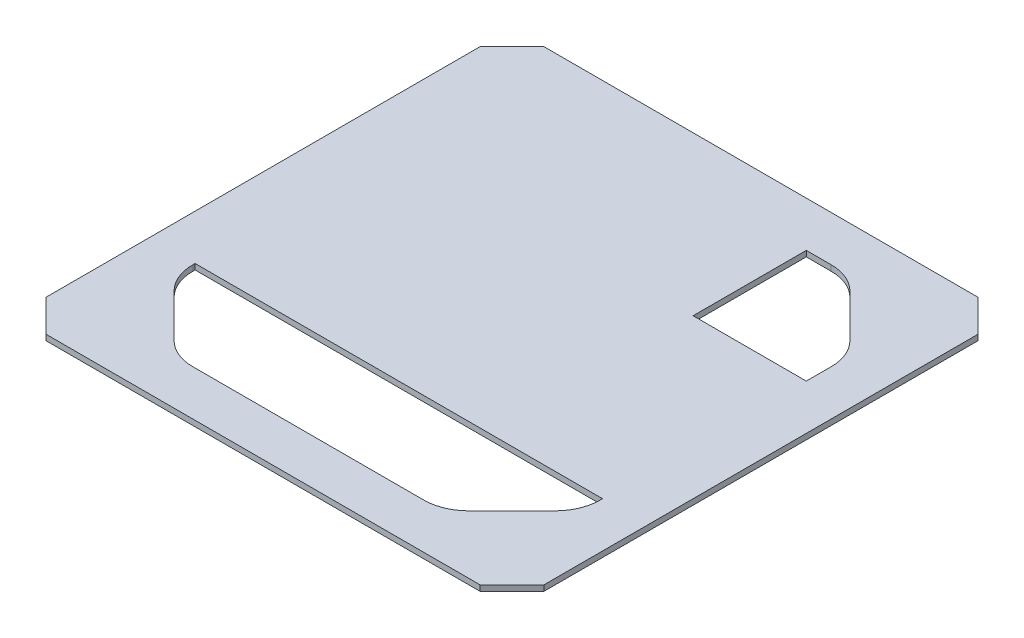
ISO-10303-21;
HEADER;
FILE_DESCRIPTION(('STEP AP214'),'2;1');
FILE_NAME('part.step','',(''),(''),'','','');
FILE_SCHEMA(('AUTOMOTIVE_DESIGN { 1 0 10303 214 1 1 1 1 }'));
ENDSEC;
DATA;
#1=APPLICATION_CONTEXT('core data for automotive mechanical design processes');
#2=APPLICATION_PROTOCOL_DEFINITION('international standard','automotive_design',2000,#1);
#3=PRODUCT_CONTEXT('',#1,'mechanical');
#4=PRODUCT('Part','Part','',(#3));
#5=PRODUCT_RELATED_PRODUCT_CATEGORY('part','',(#4));
#6=PRODUCT_DEFINITION_FORMATION('','',#4);
#7=PRODUCT_DEFINITION_CONTEXT('part definition',#1,'design');
#8=PRODUCT_DEFINITION('design','',#6,#7);
#9=PRODUCT_DEFINITION_SHAPE('','',#8);
#10=(LENGTH_UNIT() NAMED_UNIT(*) SI_UNIT(.MILLI.,.METRE.));
#11=(NAMED_UNIT(*) PLANE_ANGLE_UNIT() SI_UNIT($,.RADIAN.));
#12=(NAMED_UNIT(*) SI_UNIT($,.STERADIAN.) SOLID_ANGLE_UNIT());
#13=UNCERTAINTY_MEASURE_WITH_UNIT(LENGTH_MEASURE(1.E-05),#10,'distance_accuracy_value','');
#14=(GEOMETRIC_REPRESENTATION_CONTEXT(3) GLOBAL_UNCERTAINTY_ASSIGNED_CONTEXT((#13)) GLOBAL_UNIT_ASSIGNED_CONTEXT((#10,
#11,#12)) REPRESENTATION_CONTEXT('',''));
#15=CARTESIAN_POINT('',(0.,0.,0.));
#16=DIRECTION('',(0.,0.,1.));
#17=DIRECTION('',(1.,0.,0.));
#18=AXIS2_PLACEMENT_3D('',#15,#16,#17);
#19=CARTESIAN_POINT('',(114.3,0.,-27.0780936501646));
#20=DIRECTION('',(1.,0.,0.));
#21=DIRECTION('',(0.,0.,-1.));
#22=AXIS2_PLACEMENT_3D('',#19,#20,#21);
#23=PLANE('',#22);
#24=DIRECTION('',(0.,0.,-1.));
#25=VECTOR('',#24,1.);
#26=CARTESIAN_POINT('',(114.3,0.,-27.0780936501646));
#27=LINE('',#26,#25);
#28=CARTESIAN_POINT('',(114.3,0.,-2.58065486085614));
#29=VERTEX_POINT('',#28);
#30=CARTESIAN_POINT('',(114.3,0.,-16.557069165888));
#31=VERTEX_POINT('',#30);
#32=EDGE_CURVE('E243',#29,#31,#27,.T.);
#33=ORIENTED_EDGE('',*,*,#32,.F.);
#34=DIRECTION('',(0.,1.,0.));
#35=VECTOR('',#34,1.);
#36=CARTESIAN_POINT('',(114.3,0.,-2.58065486085614));
#37=LINE('',#36,#35);
#38=CARTESIAN_POINT('',(114.3,3.175,-2.58065486085614));
#39=VERTEX_POINT('',#38);
#40=EDGE_CURVE('E41',#29,#39,#37,.T.);
#41=ORIENTED_EDGE('',*,*,#40,.T.);
#42=DIRECTION('',(0.,0.,-1.));
#43=VECTOR('',#42,1.);
#44=CARTESIAN_POINT('',(114.3,3.175,-27.0780936501646));
#45=LINE('',#44,#43);
#46=CARTESIAN_POINT('',(114.3,3.175,-16.557069165888));
#47=VERTEX_POINT('',#46);
#48=EDGE_CURVE('E209',#39,#47,#45,.T.);
#49=ORIENTED_EDGE('',*,*,#48,.T.);
#50=DIRECTION('',(0.,1.,0.));
#51=VECTOR('',#50,1.);
#52=CARTESIAN_POINT('',(114.3,0.,-16.557069165888));
#53=LINE('',#52,#51);
#54=EDGE_CURVE('E324',#47,#31,#53,.F.);
#55=ORIENTED_EDGE('',*,*,#54,.T.);
#56=EDGE_LOOP('',(#33,#41,#49,#55));
#57=FACE_BOUND('',#56,.T.);
#58=ADVANCED_FACE('F33',(#57),#23,.F.);
#59=CARTESIAN_POINT('',(139.7,3.175,169.958832897006));
#60=DIRECTION('',(-0.707106781186548,0.,-0.707106781186547));
#61=DIRECTION('',(-0.707106781186547,0.,0.707106781186548));
#62=AXIS2_PLACEMENT_3D('',#59,#60,#61);
#63=PLANE('',#62);
#64=DIRECTION('',(0.707106781186547,0.,-0.707106781186548));
#65=VECTOR('',#64,1.);
#66=CARTESIAN_POINT('',(139.7,0.,169.958832897006));
#67=LINE('',#66,#65);
#68=CARTESIAN_POINT('',(121.739487757862,0.,187.919345139144));
#69=VERTEX_POINT('',#68);
#70=CARTESIAN_POINT('',(139.7,0.,169.958832897006));
#71=VERTEX_POINT('',#70);
#72=EDGE_CURVE('E249',#69,#71,#67,.T.);
#73=ORIENTED_EDGE('',*,*,#72,.T.);
#74=DIRECTION('',(0.,-1.,0.));
#75=VECTOR('',#74,1.);
#76=CARTESIAN_POINT('',(139.7,3.175,169.958832897006));
#77=LINE('',#76,#75);
#78=CARTESIAN_POINT('',(139.7,3.175,169.958832897006));
#79=VERTEX_POINT('',#78);
#80=EDGE_CURVE('E321',#79,#71,#77,.T.);
#81=ORIENTED_EDGE('',*,*,#80,.F.);
#82=DIRECTION('',(0.707106781186547,0.,-0.707106781186548));
#83=VECTOR('',#82,1.);
#84=CARTESIAN_POINT('',(139.7,3.175,169.958832897006));
#85=LINE('',#84,#83);
#86=CARTESIAN_POINT('',(121.739487757862,3.175,187.919345139144));
#87=VERTEX_POINT('',#86);
#88=EDGE_CURVE('E267',#87,#79,#85,.T.);
#89=ORIENTED_EDGE('',*,*,#88,.F.);
#90=DIRECTION('',(0.,-1.,0.));
#91=VECTOR('',#90,1.);
#92=CARTESIAN_POINT('',(121.739487757862,3.175,187.919345139144));
#93=LINE('',#92,#91);
#94=EDGE_CURVE('E285',#87,#69,#93,.T.);
#95=ORIENTED_EDGE('',*,*,#94,.T.);
#96=EDGE_LOOP('',(#73,#81,#89,#95));
#97=FACE_BOUND('',#96,.T.);
#98=ADVANCED_FACE('F462',(#97),#63,.F.);
#99=CARTESIAN_POINT('',(139.7,3.175,-73.5201426187178));
#100=DIRECTION('',(-1.,0.,0.));
#101=DIRECTION('',(0.,0.,1.));
#102=AXIS2_PLACEMENT_3D('',#99,#100,#101);
#103=PLANE('',#102);
#104=DIRECTION('',(0.,0.,-1.));
#105=VECTOR('',#104,1.);
#106=CARTESIAN_POINT('',(139.7,0.,-73.5201426187178));
#107=LINE('',#106,#105);
#108=CARTESIAN_POINT('',(139.7,0.,-73.5201426187178));
#109=VERTEX_POINT('',#108);
#110=EDGE_CURVE('E288',#71,#109,#107,.T.);
#111=ORIENTED_EDGE('',*,*,#110,.T.);
#112=DIRECTION('',(0.,-1.,0.));
#113=VECTOR('',#112,1.);
#114=CARTESIAN_POINT('',(139.7,3.175,-73.5201426187178));
#115=LINE('',#114,#113);
#116=CARTESIAN_POINT('',(139.7,3.175,-73.5201426187178));
#117=VERTEX_POINT('',#116);
#118=EDGE_CURVE('E318',#117,#109,#115,.T.);
#119=ORIENTED_EDGE('',*,*,#118,.F.);
#120=DIRECTION('',(0.,0.,-1.));
#121=VECTOR('',#120,1.);
#122=CARTESIAN_POINT('',(139.7,3.175,-73.5201426187178));
#123=LINE('',#122,#121);
#124=EDGE_CURVE('E270',#79,#117,#123,.T.);
#125=ORIENTED_EDGE('',*,*,#124,.F.);
#126=ORIENTED_EDGE('',*,*,#80,.T.);
#127=EDGE_LOOP('',(#111,#119,#125,#126));
#128=FACE_BOUND('',#127,.T.);
#129=ADVANCED_FACE('F467',(#128),#103,.F.);
#130=CARTESIAN_POINT('',(139.7,3.175,-73.5201426187178));
#131=DIRECTION('',(-0.707106781186548,0.,0.707106781186547));
#132=DIRECTION('',(0.707106781186547,0.,0.707106781186548));
#133=AXIS2_PLACEMENT_3D('',#130,#131,#132);
#134=PLANE('',#133);
#135=DIRECTION('',(-0.707106781186547,0.,-0.707106781186548));
#136=VECTOR('',#135,1.);
#137=CARTESIAN_POINT('',(139.7,0.,-73.5201426187178));
#138=LINE('',#137,#136);
#139=CARTESIAN_POINT('',(121.739487757862,0.,-91.4806548608561));
#140=VERTEX_POINT('',#139);
#141=EDGE_CURVE('E290',#109,#140,#138,.T.);
#142=ORIENTED_EDGE('',*,*,#141,.T.);
#143=DIRECTION('',(0.,-1.,0.));
#144=VECTOR('',#143,1.);
#145=CARTESIAN_POINT('',(121.739487757862,3.175,-91.4806548608561));
#146=LINE('',#145,#144);
#147=CARTESIAN_POINT('',(121.739487757862,3.175,-91.4806548608561));
#148=VERTEX_POINT('',#147);
#149=EDGE_CURVE('E315',#148,#140,#146,.T.);
#150=ORIENTED_EDGE('',*,*,#149,.F.);
#151=DIRECTION('',(-0.707106781186547,0.,-0.707106781186548));
#152=VECTOR('',#151,1.);
#153=CARTESIAN_POINT('',(139.7,3.175,-73.5201426187178));
#154=LINE('',#153,#152);
#155=EDGE_CURVE('E273',#117,#148,#154,.T.);
#156=ORIENTED_EDGE('',*,*,#155,.F.);
#157=ORIENTED_EDGE('',*,*,#118,.T.);
#158=EDGE_LOOP('',(#142,#150,#156,#157));
#159=FACE_BOUND('',#158,.T.);
#160=ADVANCED_FACE('F504',(#159),#134,.F.);
#161=CARTESIAN_POINT('',(-121.739487757862,3.175,-91.4806548608561));
#162=DIRECTION('',(0.,0.,1.));
#163=DIRECTION('',(1.,0.,0.));
#164=AXIS2_PLACEMENT_3D('',#161,#162,#163);
#165=PLANE('',#164);
#166=DIRECTION('',(-1.,0.,0.));
#167=VECTOR('',#166,1.);
#168=CARTESIAN_POINT('',(-121.739487757862,0.,-91.4806548608561));
#169=LINE('',#168,#167);
#170=CARTESIAN_POINT('',(-121.739487757862,0.,-91.4806548608561));
#171=VERTEX_POINT('',#170);
#172=EDGE_CURVE('E292',#140,#171,#169,.T.);
#173=ORIENTED_EDGE('',*,*,#172,.T.);
#174=DIRECTION('',(0.,-1.,0.));
#175=VECTOR('',#174,1.);
#176=CARTESIAN_POINT('',(-121.739487757862,3.175,-91.4806548608561));
#177=LINE('',#176,#175);
#178=CARTESIAN_POINT('',(-121.739487757862,3.175,-91.4806548608561));
#179=VERTEX_POINT('',#178);
#180=EDGE_CURVE('E312',#179,#171,#177,.T.);
#181=ORIENTED_EDGE('',*,*,#180,.F.);
#182=DIRECTION('',(-1.,0.,0.));
#183=VECTOR('',#182,1.);
#184=CARTESIAN_POINT('',(-121.739487757862,3.175,-91.4806548608561));
#185=LINE('',#184,#183);
#186=EDGE_CURVE('E275',#148,#179,#185,.T.);
#187=ORIENTED_EDGE('',*,*,#186,.F.);
#188=ORIENTED_EDGE('',*,*,#149,.T.);
#189=EDGE_LOOP('',(#173,#181,#187,#188));
#190=FACE_BOUND('',#189,.T.);
#191=ADVANCED_FACE('F508',(#190),#165,.F.);
#192=CARTESIAN_POINT('',(-139.7,3.175,-73.5201426187178));
#193=DIRECTION('',(0.707106781186547,0.,0.707106781186548));
#194=DIRECTION('',(0.707106781186548,0.,-0.707106781186547));
#195=AXIS2_PLACEMENT_3D('',#192,#193,#194);
#196=PLANE('',#195);
#197=DIRECTION('',(-0.707106781186548,0.,0.707106781186547));
#198=VECTOR('',#197,1.);
#199=CARTESIAN_POINT('',(-139.7,0.,-73.5201426187178));
#200=LINE('',#199,#198);
#201=CARTESIAN_POINT('',(-139.7,0.,-73.5201426187178));
#202=VERTEX_POINT('',#201);
#203=EDGE_CURVE('E294',#171,#202,#200,.T.);
#204=ORIENTED_EDGE('',*,*,#203,.T.);
#205=DIRECTION('',(0.,-1.,0.));
#206=VECTOR('',#205,1.);
#207=CARTESIAN_POINT('',(-139.7,3.175,-73.5201426187178));
#208=LINE('',#207,#206);
#209=CARTESIAN_POINT('',(-139.7,3.175,-73.5201426187178));
#210=VERTEX_POINT('',#209);
#211=EDGE_CURVE('E309',#210,#202,#208,.T.);
#212=ORIENTED_EDGE('',*,*,#211,.F.);
#213=DIRECTION('',(-0.707106781186548,0.,0.707106781186547));
#214=VECTOR('',#213,1.);
#215=CARTESIAN_POINT('',(-139.7,3.175,-73.5201426187178));
#216=LINE('',#215,#214);
#217=EDGE_CURVE('E277',#179,#210,#216,.T.);
#218=ORIENTED_EDGE('',*,*,#217,.F.);
#219=ORIENTED_EDGE('',*,*,#180,.T.);
#220=EDGE_LOOP('',(#204,#212,#218,#219));
#221=FACE_BOUND('',#220,.T.);
#222=ADVANCED_FACE('F512',(#221),#196,.F.);
#223=CARTESIAN_POINT('',(-139.7,3.175,-73.5201426187178));
#224=DIRECTION('',(1.,0.,0.));
#225=DIRECTION('',(0.,0.,-1.));
#226=AXIS2_PLACEMENT_3D('',#223,#224,#225);
#227=PLANE('',#226);
#228=DIRECTION('',(0.,-1.,0.));
#229=VECTOR('',#228,1.);
#230=CARTESIAN_POINT('',(-139.7,3.175,169.958832897006));
#231=LINE('',#230,#229);
#232=CARTESIAN_POINT('',(-139.7,3.175,169.958832897006));
#233=VERTEX_POINT('',#232);
#234=CARTESIAN_POINT('',(-139.7,0.,169.958832897006));
#235=VERTEX_POINT('',#234);
#236=EDGE_CURVE('E306',#233,#235,#231,.T.);
#237=ORIENTED_EDGE('',*,*,#236,.F.);
#238=DIRECTION('',(0.,0.,1.));
#239=VECTOR('',#238,1.);
#240=CARTESIAN_POINT('',(-139.7,3.175,-73.5201426187178));
#241=LINE('',#240,#239);
#242=EDGE_CURVE('E279',#210,#233,#241,.T.);
#243=ORIENTED_EDGE('',*,*,#242,.F.);
#244=ORIENTED_EDGE('',*,*,#211,.T.);
#245=DIRECTION('',(0.,0.,1.));
#246=VECTOR('',#245,1.);
#247=CARTESIAN_POINT('',(-139.7,0.,-73.5201426187178));
#248=LINE('',#247,#246);
#249=EDGE_CURVE('E296',#202,#235,#248,.T.);
#250=ORIENTED_EDGE('',*,*,#249,.T.);
#251=EDGE_LOOP('',(#237,#243,#244,#250));
#252=FACE_BOUND('',#251,.T.);
#253=ADVANCED_FACE('F516',(#252),#227,.F.);
#254=CARTESIAN_POINT('',(-139.7,3.175,169.958832897006));
#255=DIRECTION('',(0.707106781186547,0.,-0.707106781186548));
#256=DIRECTION('',(-0.707106781186548,0.,-0.707106781186547));
#257=AXIS2_PLACEMENT_3D('',#254,#255,#256);
#258=PLANE('',#257);
#259=DIRECTION('',(0.707106781186548,0.,0.707106781186547));
#260=VECTOR('',#259,1.);
#261=CARTESIAN_POINT('',(-139.7,0.,169.958832897006));
#262=LINE('',#261,#260);
#263=CARTESIAN_POINT('',(-121.739487757862,0.,187.919345139144));
#264=VERTEX_POINT('',#263);
#265=EDGE_CURVE('E298',#235,#264,#262,.T.);
#266=ORIENTED_EDGE('',*,*,#265,.T.);
#267=DIRECTION('',(0.,-1.,0.));
#268=VECTOR('',#267,1.);
#269=CARTESIAN_POINT('',(-121.739487757862,3.175,187.919345139144));
#270=LINE('',#269,#268);
#271=CARTESIAN_POINT('',(-121.739487757862,3.175,187.919345139144));
#272=VERTEX_POINT('',#271);
#273=EDGE_CURVE('E303',#272,#264,#270,.T.);
#274=ORIENTED_EDGE('',*,*,#273,.F.);
#275=DIRECTION('',(0.707106781186548,0.,0.707106781186547));
#276=VECTOR('',#275,1.);
#277=CARTESIAN_POINT('',(-139.7,3.175,169.958832897006));
#278=LINE('',#277,#276);
#279=EDGE_CURVE('E281',#233,#272,#278,.T.);
#280=ORIENTED_EDGE('',*,*,#279,.F.);
#281=ORIENTED_EDGE('',*,*,#236,.T.);
#282=EDGE_LOOP('',(#266,#274,#280,#281));
#283=FACE_BOUND('',#282,.T.);
#284=ADVANCED_FACE('F520',(#283),#258,.F.);
#285=CARTESIAN_POINT('',(-121.739487757862,3.175,187.919345139144));
#286=DIRECTION('',(0.,0.,-1.));
#287=DIRECTION('',(-1.,0.,0.));
#288=AXIS2_PLACEMENT_3D('',#285,#286,#287);
#289=PLANE('',#288);
#290=DIRECTION('',(1.,0.,0.));
#291=VECTOR('',#290,1.);
#292=CARTESIAN_POINT('',(-121.739487757862,0.,187.919345139144));
#293=LINE('',#292,#291);
#294=EDGE_CURVE('E271',#264,#69,#293,.T.);
#295=ORIENTED_EDGE('',*,*,#294,.T.);
#296=ORIENTED_EDGE('',*,*,#94,.F.);
#297=DIRECTION('',(1.,0.,0.));
#298=VECTOR('',#297,1.);
#299=CARTESIAN_POINT('',(-121.739487757862,3.175,187.919345139144));
#300=LINE('',#299,#298);
#301=EDGE_CURVE('E283',#272,#87,#300,.T.);
#302=ORIENTED_EDGE('',*,*,#301,.F.);
#303=ORIENTED_EDGE('',*,*,#273,.T.);
#304=EDGE_LOOP('',(#295,#296,#302,#303));
#305=FACE_BOUND('',#304,.T.);
#306=ADVANCED_FACE('F456',(#305),#289,.F.);
#307=CARTESIAN_POINT('',(0.,3.175,0.));
#308=DIRECTION('',(0.,1.,0.));
#309=DIRECTION('',(0.,0.,1.));
#310=AXIS2_PLACEMENT_3D('',#307,#308,#309);
#311=PLANE('',#310);
#312=ORIENTED_EDGE('',*,*,#217,.T.);
#313=ORIENTED_EDGE('',*,*,#242,.T.);
#314=ORIENTED_EDGE('',*,*,#279,.T.);
#315=ORIENTED_EDGE('',*,*,#301,.T.);
#316=ORIENTED_EDGE('',*,*,#88,.T.);
#317=ORIENTED_EDGE('',*,*,#124,.T.);
#318=ORIENTED_EDGE('',*,*,#155,.T.);
#319=ORIENTED_EDGE('',*,*,#186,.T.);
#320=EDGE_LOOP('',(#312,#313,#314,#315,#316,#317,#318,#319));
#321=FACE_BOUND('',#320,.T.);
#322=DIRECTION('',(0.,0.,1.));
#323=VECTOR('',#322,1.);
#324=CARTESIAN_POINT('',(-114.3,3.175,-27.0780936501646));
#325=LINE('',#324,#323);
#326=CARTESIAN_POINT('',(-114.3,3.175,111.719345139144));
#327=VERTEX_POINT('',#326);
#328=CARTESIAN_POINT('',(-114.3,3.175,112.995759444176));
#329=VERTEX_POINT('',#328);
#330=EDGE_CURVE('E251',#327,#329,#325,.T.);
#331=ORIENTED_EDGE('',*,*,#330,.F.);
#332=DIRECTION('',(1.,0.,0.));
#333=VECTOR('',#332,1.);
#334=CARTESIAN_POINT('',(-139.7,3.175,111.719345139144));
#335=LINE('',#334,#333);
#336=CARTESIAN_POINT('',(114.3,3.175,111.719345139144));
#337=VERTEX_POINT('',#336);
#338=EDGE_CURVE('E212',#327,#337,#335,.T.);
#339=ORIENTED_EDGE('',*,*,#338,.T.);
#340=CARTESIAN_POINT('',(114.3,3.175,112.995759444176));
#341=VERTEX_POINT('',#340);
#342=EDGE_CURVE('E262',#341,#337,#45,.T.);
#343=ORIENTED_EDGE('',*,*,#342,.F.);
#344=CARTESIAN_POINT('',(88.9000000000001,3.175,112.995759444176));
#345=DIRECTION('',(0.,1.,0.));
#346=DIRECTION('',(0.,0.,1.));
#347=AXIS2_PLACEMENT_3D('',#344,#345,#346);
#348=CIRCLE('',#347,25.4);
#349=CARTESIAN_POINT('',(106.860512242138,3.175,130.956271686314));
#350=VERTEX_POINT('',#349);
#351=EDGE_CURVE('E356',#341,#350,#348,.F.);
#352=ORIENTED_EDGE('',*,*,#351,.T.);
#353=DIRECTION('',(0.707106781186547,0.,-0.707106781186548));
#354=VECTOR('',#353,1.);
#355=CARTESIAN_POINT('',(103.778975515723,3.175,134.037808412729));
#356=LINE('',#355,#354);
#357=CARTESIAN_POINT('',(82.7369265471703,3.175,155.079857381282));
#358=VERTEX_POINT('',#357);
#359=EDGE_CURVE('E259',#358,#350,#356,.T.);
#360=ORIENTED_EDGE('',*,*,#359,.F.);
#361=CARTESIAN_POINT('',(64.776414305032,3.175,137.119345139144));
#362=DIRECTION('',(0.,1.,0.));
#363=DIRECTION('',(0.,0.,1.));
#364=AXIS2_PLACEMENT_3D('',#361,#362,#363);
#365=CIRCLE('',#364,25.4);
#366=CARTESIAN_POINT('',(64.776414305032,3.175,162.519345139144));
#367=VERTEX_POINT('',#366);
#368=EDGE_CURVE('E360',#358,#367,#365,.F.);
#369=ORIENTED_EDGE('',*,*,#368,.T.);
#370=DIRECTION('',(1.,0.,0.));
#371=VECTOR('',#370,1.);
#372=CARTESIAN_POINT('',(-75.2974387893084,3.175,162.519345139144));
#373=LINE('',#372,#371);
#374=CARTESIAN_POINT('',(-64.7764143050318,3.175,162.519345139144));
#375=VERTEX_POINT('',#374);
#376=EDGE_CURVE('E256',#375,#367,#373,.T.);
#377=ORIENTED_EDGE('',*,*,#376,.F.);
#378=CARTESIAN_POINT('',(-64.7764143050318,3.175,137.119345139144));
#379=DIRECTION('',(0.,1.,0.));
#380=DIRECTION('',(0.,0.,1.));
#381=AXIS2_PLACEMENT_3D('',#378,#379,#380);
#382=CIRCLE('',#381,25.4);
#383=CARTESIAN_POINT('',(-82.7369265471701,3.175,155.079857381282));
#384=VERTEX_POINT('',#383);
#385=EDGE_CURVE('E364',#375,#384,#382,.F.);
#386=ORIENTED_EDGE('',*,*,#385,.T.);
#387=DIRECTION('',(0.707106781186548,0.,0.707106781186547));
#388=VECTOR('',#387,1.);
#389=CARTESIAN_POINT('',(-85.818463273585,3.175,151.998320654867));
#390=LINE('',#389,#388);
#391=CARTESIAN_POINT('',(-106.860512242138,3.175,130.956271686314));
#392=VERTEX_POINT('',#391);
#393=EDGE_CURVE('E253',#392,#384,#390,.T.);
#394=ORIENTED_EDGE('',*,*,#393,.F.);
#395=CARTESIAN_POINT('',(-88.9,3.175,112.995759444176));
#396=DIRECTION('',(0.,1.,0.));
#397=DIRECTION('',(0.,0.,1.));
#398=AXIS2_PLACEMENT_3D('',#395,#396,#397);
#399=CIRCLE('',#398,25.4);
#400=EDGE_CURVE('E368',#392,#329,#399,.F.);
#401=ORIENTED_EDGE('',*,*,#400,.T.);
#402=EDGE_LOOP('',(#331,#339,#343,#352,#360,#369,#377,#386,#394,#401));
#403=FACE_BOUND('',#402,.T.);
#404=DIRECTION('',(0.,0.,-1.));
#405=VECTOR('',#404,1.);
#406=CARTESIAN_POINT('',(50.8,3.175,-2.58065486085614));
#407=LINE('',#406,#405);
#408=CARTESIAN_POINT('',(50.8,3.175,-2.58065486085614));
#409=VERTEX_POINT('',#408);
#410=CARTESIAN_POINT('',(50.8,3.175,-66.0806548608562));
#411=VERTEX_POINT('',#410);
#412=EDGE_CURVE('E206',#409,#411,#407,.T.);
#413=ORIENTED_EDGE('',*,*,#412,.T.);
#414=DIRECTION('',(-1.,0.,0.));
#415=VECTOR('',#414,1.);
#416=CARTESIAN_POINT('',(-75.2974387893084,3.175,-66.0806548608562));
#417=LINE('',#416,#415);
#418=CARTESIAN_POINT('',(64.7764143050318,3.175,-66.0806548608562));
#419=VERTEX_POINT('',#418);
#420=EDGE_CURVE('E227',#419,#411,#417,.T.);
#421=ORIENTED_EDGE('',*,*,#420,.F.);
#422=CARTESIAN_POINT('',(64.7764143050318,3.175,-40.6806548608562));
#423=DIRECTION('',(0.,1.,0.));
#424=DIRECTION('',(0.,0.,1.));
#425=AXIS2_PLACEMENT_3D('',#422,#423,#424);
#426=CIRCLE('',#425,25.4);
#427=CARTESIAN_POINT('',(82.7369265471701,3.175,-58.6411671029945));
#428=VERTEX_POINT('',#427);
#429=EDGE_CURVE('E377',#419,#428,#426,.F.);
#430=ORIENTED_EDGE('',*,*,#429,.T.);
#431=DIRECTION('',(-0.707106781186548,0.,-0.707106781186547));
#432=VECTOR('',#431,1.);
#433=CARTESIAN_POINT('',(85.8184632735851,3.175,-55.5596303765795));
#434=LINE('',#433,#432);
#435=CARTESIAN_POINT('',(106.860512242138,3.175,-34.5175814080263));
#436=VERTEX_POINT('',#435);
#437=EDGE_CURVE('E232',#436,#428,#434,.T.);
#438=ORIENTED_EDGE('',*,*,#437,.F.);
#439=CARTESIAN_POINT('',(88.9000000000001,3.175,-16.557069165888));
#440=DIRECTION('',(0.,1.,0.));
#441=DIRECTION('',(0.,0.,1.));
#442=AXIS2_PLACEMENT_3D('',#439,#440,#441);
#443=CIRCLE('',#442,25.4);
#444=EDGE_CURVE('E373',#436,#47,#443,.F.);
#445=ORIENTED_EDGE('',*,*,#444,.T.);
#446=ORIENTED_EDGE('',*,*,#48,.F.);
#447=DIRECTION('',(-1.,0.,0.));
#448=VECTOR('',#447,1.);
#449=CARTESIAN_POINT('',(50.8,3.175,-2.58065486085614));
#450=LINE('',#449,#448);
#451=EDGE_CURVE('E201',#39,#409,#450,.T.);
#452=ORIENTED_EDGE('',*,*,#451,.T.);
#453=EDGE_LOOP('',(#413,#421,#430,#438,#445,#446,#452));
#454=FACE_BOUND('',#453,.T.);
#455=ADVANCED_FACE('F203',(#321,#403,#454),#311,.T.);
#456=CARTESIAN_POINT('',(0.,0.,0.));
#457=DIRECTION('',(0.,1.,0.));
#458=DIRECTION('',(0.,0.,1.));
#459=AXIS2_PLACEMENT_3D('',#456,#457,#458);
#460=PLANE('',#459);
#461=ORIENTED_EDGE('',*,*,#249,.F.);
#462=ORIENTED_EDGE('',*,*,#203,.F.);
#463=ORIENTED_EDGE('',*,*,#172,.F.);
#464=ORIENTED_EDGE('',*,*,#141,.F.);
#465=ORIENTED_EDGE('',*,*,#110,.F.);
#466=ORIENTED_EDGE('',*,*,#72,.F.);
#467=ORIENTED_EDGE('',*,*,#294,.F.);
#468=ORIENTED_EDGE('',*,*,#265,.F.);
#469=EDGE_LOOP('',(#461,#462,#463,#464,#465,#466,#467,#468));
#470=FACE_BOUND('',#469,.T.);
#471=DIRECTION('',(-1.,0.,0.));
#472=VECTOR('',#471,1.);
#473=CARTESIAN_POINT('',(-139.7,0.,111.719345139144));
#474=LINE('',#473,#472);
#475=CARTESIAN_POINT('',(114.3,0.,111.719345139144));
#476=VERTEX_POINT('',#475);
#477=CARTESIAN_POINT('',(-114.3,0.,111.719345139144));
#478=VERTEX_POINT('',#477);
#479=EDGE_CURVE('E218',#476,#478,#474,.T.);
#480=ORIENTED_EDGE('',*,*,#479,.T.);
#481=DIRECTION('',(0.,0.,1.));
#482=VECTOR('',#481,1.);
#483=CARTESIAN_POINT('',(-114.3,0.,-27.0780936501646));
#484=LINE('',#483,#482);
#485=CARTESIAN_POINT('',(-114.3,0.,112.995759444176));
#486=VERTEX_POINT('',#485);
#487=EDGE_CURVE('E231',#478,#486,#484,.T.);
#488=ORIENTED_EDGE('',*,*,#487,.T.);
#489=CARTESIAN_POINT('',(-88.9,0.,112.995759444176));
#490=DIRECTION('',(0.,1.,0.));
#491=DIRECTION('',(0.,0.,1.));
#492=AXIS2_PLACEMENT_3D('',#489,#490,#491);
#493=CIRCLE('',#492,25.4);
#494=CARTESIAN_POINT('',(-106.860512242138,0.,130.956271686314));
#495=VERTEX_POINT('',#494);
#496=EDGE_CURVE('E371',#486,#495,#493,.T.);
#497=ORIENTED_EDGE('',*,*,#496,.T.);
#498=DIRECTION('',(0.707106781186547,0.,0.707106781186548));
#499=VECTOR('',#498,1.);
#500=CARTESIAN_POINT('',(-103.778975515723,0.,134.037808412729));
#501=LINE('',#500,#499);
#502=CARTESIAN_POINT('',(-82.7369265471702,0.,155.079857381282));
#503=VERTEX_POINT('',#502);
#504=EDGE_CURVE('E234',#495,#503,#501,.T.);
#505=ORIENTED_EDGE('',*,*,#504,.T.);
#506=CARTESIAN_POINT('',(-64.7764143050318,0.,137.119345139144));
#507=DIRECTION('',(0.,1.,0.));
#508=DIRECTION('',(0.,0.,1.));
#509=AXIS2_PLACEMENT_3D('',#506,#507,#508);
#510=CIRCLE('',#509,25.4);
#511=CARTESIAN_POINT('',(-64.7764143050318,0.,162.519345139144));
#512=VERTEX_POINT('',#511);
#513=EDGE_CURVE('E366',#503,#512,#510,.T.);
#514=ORIENTED_EDGE('',*,*,#513,.T.);
#515=DIRECTION('',(1.,0.,0.));
#516=VECTOR('',#515,1.);
#517=CARTESIAN_POINT('',(-75.2974387893084,0.,162.519345139144));
#518=LINE('',#517,#516);
#519=CARTESIAN_POINT('',(64.776414305032,0.,162.519345139144));
#520=VERTEX_POINT('',#519);
#521=EDGE_CURVE('E237',#512,#520,#518,.T.);
#522=ORIENTED_EDGE('',*,*,#521,.T.);
#523=CARTESIAN_POINT('',(64.776414305032,0.,137.119345139144));
#524=DIRECTION('',(0.,1.,0.));
#525=DIRECTION('',(0.,0.,1.));
#526=AXIS2_PLACEMENT_3D('',#523,#524,#525);
#527=CIRCLE('',#526,25.4);
#528=CARTESIAN_POINT('',(82.7369265471703,0.,155.079857381282));
#529=VERTEX_POINT('',#528);
#530=EDGE_CURVE('E362',#520,#529,#527,.T.);
#531=ORIENTED_EDGE('',*,*,#530,.T.);
#532=DIRECTION('',(0.707106781186548,0.,-0.707106781186547));
#533=VECTOR('',#532,1.);
#534=CARTESIAN_POINT('',(85.8184632735851,0.,151.998320654867));
#535=LINE('',#534,#533);
#536=CARTESIAN_POINT('',(106.860512242138,0.,130.956271686314));
#537=VERTEX_POINT('',#536);
#538=EDGE_CURVE('E240',#529,#537,#535,.T.);
#539=ORIENTED_EDGE('',*,*,#538,.T.);
#540=CARTESIAN_POINT('',(88.9000000000001,0.,112.995759444176));
#541=DIRECTION('',(0.,1.,0.));
#542=DIRECTION('',(0.,0.,1.));
#543=AXIS2_PLACEMENT_3D('',#540,#541,#542);
#544=CIRCLE('',#543,25.4);
#545=CARTESIAN_POINT('',(114.3,0.,112.995759444176));
#546=VERTEX_POINT('',#545);
#547=EDGE_CURVE('E358',#537,#546,#544,.T.);
#548=ORIENTED_EDGE('',*,*,#547,.T.);
#549=EDGE_CURVE('E244',#546,#476,#27,.T.);
#550=ORIENTED_EDGE('',*,*,#549,.T.);
#551=EDGE_LOOP('',(#480,#488,#497,#505,#514,#522,#531,#539,#548,#550));
#552=FACE_BOUND('',#551,.T.);
#553=DIRECTION('',(-1.,0.,0.));
#554=VECTOR('',#553,1.);
#555=CARTESIAN_POINT('',(-75.2974387893084,0.,-66.0806548608562));
#556=LINE('',#555,#554);
#557=CARTESIAN_POINT('',(64.7764143050318,0.,-66.0806548608562));
#558=VERTEX_POINT('',#557);
#559=CARTESIAN_POINT('',(50.8,0.,-66.0806548608562));
#560=VERTEX_POINT('',#559);
#561=EDGE_CURVE('E229',#558,#560,#556,.T.);
#562=ORIENTED_EDGE('',*,*,#561,.T.);
#563=DIRECTION('',(0.,0.,1.));
#564=VECTOR('',#563,1.);
#565=CARTESIAN_POINT('',(50.8,0.,-2.58065486085614));
#566=LINE('',#565,#564);
#567=CARTESIAN_POINT('',(50.8,0.,-2.58065486085614));
#568=VERTEX_POINT('',#567);
#569=EDGE_CURVE('E228',#560,#568,#566,.T.);
#570=ORIENTED_EDGE('',*,*,#569,.T.);
#571=DIRECTION('',(1.,0.,0.));
#572=VECTOR('',#571,1.);
#573=CARTESIAN_POINT('',(50.8,0.,-2.58065486085614));
#574=LINE('',#573,#572);
#575=EDGE_CURVE('E48',#568,#29,#574,.T.);
#576=ORIENTED_EDGE('',*,*,#575,.T.);
#577=ORIENTED_EDGE('',*,*,#32,.T.);
#578=CARTESIAN_POINT('',(88.9000000000001,0.,-16.557069165888));
#579=DIRECTION('',(0.,1.,0.));
#580=DIRECTION('',(0.,0.,1.));
#581=AXIS2_PLACEMENT_3D('',#578,#579,#580);
#582=CIRCLE('',#581,25.4);
#583=CARTESIAN_POINT('',(106.860512242138,0.,-34.5175814080263));
#584=VERTEX_POINT('',#583);
#585=EDGE_CURVE('E375',#31,#584,#582,.T.);
#586=ORIENTED_EDGE('',*,*,#585,.T.);
#587=DIRECTION('',(-0.707106781186547,0.,-0.707106781186548));
#588=VECTOR('',#587,1.);
#589=CARTESIAN_POINT('',(103.778975515723,0.,-37.5991181344412));
#590=LINE('',#589,#588);
#591=CARTESIAN_POINT('',(82.7369265471701,0.,-58.6411671029945));
#592=VERTEX_POINT('',#591);
#593=EDGE_CURVE('E247',#584,#592,#590,.T.);
#594=ORIENTED_EDGE('',*,*,#593,.T.);
#595=CARTESIAN_POINT('',(64.7764143050318,0.,-40.6806548608562));
#596=DIRECTION('',(0.,1.,0.));
#597=DIRECTION('',(0.,0.,1.));
#598=AXIS2_PLACEMENT_3D('',#595,#596,#597);
#599=CIRCLE('',#598,25.4);
#600=EDGE_CURVE('E55',#592,#558,#599,.T.);
#601=ORIENTED_EDGE('',*,*,#600,.T.);
#602=EDGE_LOOP('',(#562,#570,#576,#577,#586,#594,#601));
#603=FACE_BOUND('',#602,.T.);
#604=ADVANCED_FACE('F386',(#470,#552,#603),#460,.F.);
#605=CARTESIAN_POINT('',(-75.2974387893084,0.,-66.0806548608562));
#606=DIRECTION('',(0.,0.,-1.));
#607=DIRECTION('',(-1.,0.,0.));
#608=AXIS2_PLACEMENT_3D('',#605,#606,#607);
#609=PLANE('',#608);
#610=ORIENTED_EDGE('',*,*,#420,.T.);
#611=DIRECTION('',(0.,-1.,0.));
#612=VECTOR('',#611,1.);
#613=CARTESIAN_POINT('',(50.8,0.,-66.0806548608562));
#614=LINE('',#613,#612);
#615=EDGE_CURVE('E11',#411,#560,#614,.T.);
#616=ORIENTED_EDGE('',*,*,#615,.T.);
#617=ORIENTED_EDGE('',*,*,#561,.F.);
#618=DIRECTION('',(0.,1.,0.));
#619=VECTOR('',#618,1.);
#620=CARTESIAN_POINT('',(64.7764143050318,3.175,-66.0806548608562));
#621=LINE('',#620,#619);
#622=EDGE_CURVE('E353',#558,#419,#621,.T.);
#623=ORIENTED_EDGE('',*,*,#622,.T.);
#624=EDGE_LOOP('',(#610,#616,#617,#623));
#625=FACE_BOUND('',#624,.T.);
#626=ADVANCED_FACE('F398',(#625),#609,.F.);
#627=CARTESIAN_POINT('',(85.8184632735851,0.,-55.5596303765795));
#628=DIRECTION('',(0.707106781186547,0.,-0.707106781186548));
#629=DIRECTION('',(-0.707106781186548,0.,-0.707106781186547));
#630=AXIS2_PLACEMENT_3D('',#627,#628,#629);
#631=PLANE('',#630);
#632=ORIENTED_EDGE('',*,*,#593,.F.);
#633=DIRECTION('',(0.,1.,0.));
#634=VECTOR('',#633,1.);
#635=CARTESIAN_POINT('',(106.860512242138,3.175,-34.5175814080263));
#636=LINE('',#635,#634);
#637=EDGE_CURVE('E350',#584,#436,#636,.T.);
#638=ORIENTED_EDGE('',*,*,#637,.T.);
#639=ORIENTED_EDGE('',*,*,#437,.T.);
#640=DIRECTION('',(0.,1.,0.));
#641=VECTOR('',#640,1.);
#642=CARTESIAN_POINT('',(82.7369265471701,0.,-58.6411671029945));
#643=LINE('',#642,#641);
#644=EDGE_CURVE('E348',#428,#592,#643,.F.);
#645=ORIENTED_EDGE('',*,*,#644,.T.);
#646=EDGE_LOOP('',(#632,#638,#639,#645));
#647=FACE_BOUND('',#646,.T.);
#648=ADVANCED_FACE('F391',(#647),#631,.F.);
#649=ORIENTED_EDGE('',*,*,#342,.T.);
#650=DIRECTION('',(0.,-1.,0.));
#651=VECTOR('',#650,1.);
#652=CARTESIAN_POINT('',(114.3,0.,111.719345139144));
#653=LINE('',#652,#651);
#654=EDGE_CURVE('E224',#337,#476,#653,.T.);
#655=ORIENTED_EDGE('',*,*,#654,.T.);
#656=ORIENTED_EDGE('',*,*,#549,.F.);
#657=DIRECTION('',(0.,1.,0.));
#658=VECTOR('',#657,1.);
#659=CARTESIAN_POINT('',(114.3,3.175,112.995759444176));
#660=LINE('',#659,#658);
#661=EDGE_CURVE('E327',#546,#341,#660,.T.);
#662=ORIENTED_EDGE('',*,*,#661,.T.);
#663=EDGE_LOOP('',(#649,#655,#656,#662));
#664=FACE_BOUND('',#663,.T.);
#665=ADVANCED_FACE('F408',(#664),#23,.F.);
#666=CARTESIAN_POINT('',(103.778975515723,0.,134.037808412729));
#667=DIRECTION('',(0.707106781186548,0.,0.707106781186547));
#668=DIRECTION('',(0.707106781186547,0.,-0.707106781186548));
#669=AXIS2_PLACEMENT_3D('',#666,#667,#668);
#670=PLANE('',#669);
#671=ORIENTED_EDGE('',*,*,#359,.T.);
#672=DIRECTION('',(0.,1.,0.));
#673=VECTOR('',#672,1.);
#674=CARTESIAN_POINT('',(106.860512242138,0.,130.956271686314));
#675=LINE('',#674,#673);
#676=EDGE_CURVE('E333',#350,#537,#675,.F.);
#677=ORIENTED_EDGE('',*,*,#676,.T.);
#678=ORIENTED_EDGE('',*,*,#538,.F.);
#679=DIRECTION('',(0.,1.,0.));
#680=VECTOR('',#679,1.);
#681=CARTESIAN_POINT('',(82.7369265471703,3.175,155.079857381282));
#682=LINE('',#681,#680);
#683=EDGE_CURVE('E330',#529,#358,#682,.T.);
#684=ORIENTED_EDGE('',*,*,#683,.T.);
#685=EDGE_LOOP('',(#671,#677,#678,#684));
#686=FACE_BOUND('',#685,.T.);
#687=ADVANCED_FACE('F417',(#686),#670,.F.);
#688=CARTESIAN_POINT('',(-75.2974387893084,0.,162.519345139144));
#689=DIRECTION('',(0.,0.,1.));
#690=DIRECTION('',(1.,0.,0.));
#691=AXIS2_PLACEMENT_3D('',#688,#689,#690);
#692=PLANE('',#691);
#693=ORIENTED_EDGE('',*,*,#376,.T.);
#694=DIRECTION('',(0.,1.,0.));
#695=VECTOR('',#694,1.);
#696=CARTESIAN_POINT('',(64.776414305032,0.,162.519345139144));
#697=LINE('',#696,#695);
#698=EDGE_CURVE('E338',#367,#520,#697,.F.);
#699=ORIENTED_EDGE('',*,*,#698,.T.);
#700=ORIENTED_EDGE('',*,*,#521,.F.);
#701=DIRECTION('',(0.,1.,0.));
#702=VECTOR('',#701,1.);
#703=CARTESIAN_POINT('',(-64.7764143050318,3.175,162.519345139144));
#704=LINE('',#703,#702);
#705=EDGE_CURVE('E335',#512,#375,#704,.T.);
#706=ORIENTED_EDGE('',*,*,#705,.T.);
#707=EDGE_LOOP('',(#693,#699,#700,#706));
#708=FACE_BOUND('',#707,.T.);
#709=ADVANCED_FACE('F426',(#708),#692,.F.);
#710=CARTESIAN_POINT('',(-85.818463273585,0.,151.998320654867));
#711=DIRECTION('',(-0.707106781186547,0.,0.707106781186548));
#712=DIRECTION('',(0.707106781186548,0.,0.707106781186547));
#713=AXIS2_PLACEMENT_3D('',#710,#711,#712);
#714=PLANE('',#713);
#715=ORIENTED_EDGE('',*,*,#393,.T.);
#716=DIRECTION('',(0.,1.,0.));
#717=VECTOR('',#716,1.);
#718=CARTESIAN_POINT('',(-82.7369265471701,0.,155.079857381282));
#719=LINE('',#718,#717);
#720=EDGE_CURVE('E343',#384,#503,#719,.F.);
#721=ORIENTED_EDGE('',*,*,#720,.T.);
#722=ORIENTED_EDGE('',*,*,#504,.F.);
#723=DIRECTION('',(0.,1.,0.));
#724=VECTOR('',#723,1.);
#725=CARTESIAN_POINT('',(-106.860512242138,3.175,130.956271686314));
#726=LINE('',#725,#724);
#727=EDGE_CURVE('E340',#495,#392,#726,.T.);
#728=ORIENTED_EDGE('',*,*,#727,.T.);
#729=EDGE_LOOP('',(#715,#721,#722,#728));
#730=FACE_BOUND('',#729,.T.);
#731=ADVANCED_FACE('F435',(#730),#714,.F.);
#732=CARTESIAN_POINT('',(-114.3,0.,-27.0780936501646));
#733=DIRECTION('',(-1.,0.,0.));
#734=DIRECTION('',(0.,0.,1.));
#735=AXIS2_PLACEMENT_3D('',#732,#733,#734);
#736=PLANE('',#735);
#737=ORIENTED_EDGE('',*,*,#487,.F.);
#738=DIRECTION('',(0.,1.,0.));
#739=VECTOR('',#738,1.);
#740=CARTESIAN_POINT('',(-114.3,0.,111.719345139144));
#741=LINE('',#740,#739);
#742=EDGE_CURVE('E380',#478,#327,#741,.T.);
#743=ORIENTED_EDGE('',*,*,#742,.T.);
#744=ORIENTED_EDGE('',*,*,#330,.T.);
#745=DIRECTION('',(0.,1.,0.));
#746=VECTOR('',#745,1.);
#747=CARTESIAN_POINT('',(-114.3,0.,112.995759444176));
#748=LINE('',#747,#746);
#749=EDGE_CURVE('E345',#329,#486,#748,.F.);
#750=ORIENTED_EDGE('',*,*,#749,.T.);
#751=EDGE_LOOP('',(#737,#743,#744,#750));
#752=FACE_BOUND('',#751,.T.);
#753=ADVANCED_FACE('F444',(#752),#736,.F.);
#754=CARTESIAN_POINT('',(88.9000000000001,0.,112.995759444176));
#755=DIRECTION('',(0.,-1.,0.));
#756=DIRECTION('',(0.,0.,-1.));
#757=AXIS2_PLACEMENT_3D('',#754,#755,#756);
#758=CYLINDRICAL_SURFACE('',#757,25.4);
#759=ORIENTED_EDGE('',*,*,#547,.F.);
#760=ORIENTED_EDGE('',*,*,#676,.F.);
#761=ORIENTED_EDGE('',*,*,#351,.F.);
#762=ORIENTED_EDGE('',*,*,#661,.F.);
#763=EDGE_LOOP('',(#759,#760,#761,#762));
#764=FACE_BOUND('',#763,.T.);
#765=ADVANCED_FACE('F413',(#764),#758,.F.);
#766=CARTESIAN_POINT('',(64.776414305032,0.,137.119345139144));
#767=DIRECTION('',(0.,-1.,0.));
#768=DIRECTION('',(0.,0.,-1.));
#769=AXIS2_PLACEMENT_3D('',#766,#767,#768);
#770=CYLINDRICAL_SURFACE('',#769,25.4);
#771=ORIENTED_EDGE('',*,*,#530,.F.);
#772=ORIENTED_EDGE('',*,*,#698,.F.);
#773=ORIENTED_EDGE('',*,*,#368,.F.);
#774=ORIENTED_EDGE('',*,*,#683,.F.);
#775=EDGE_LOOP('',(#771,#772,#773,#774));
#776=FACE_BOUND('',#775,.T.);
#777=ADVANCED_FACE('F422',(#776),#770,.F.);
#778=CARTESIAN_POINT('',(-64.7764143050318,0.,137.119345139144));
#779=DIRECTION('',(0.,-1.,0.));
#780=DIRECTION('',(0.,0.,-1.));
#781=AXIS2_PLACEMENT_3D('',#778,#779,#780);
#782=CYLINDRICAL_SURFACE('',#781,25.4);
#783=ORIENTED_EDGE('',*,*,#513,.F.);
#784=ORIENTED_EDGE('',*,*,#720,.F.);
#785=ORIENTED_EDGE('',*,*,#385,.F.);
#786=ORIENTED_EDGE('',*,*,#705,.F.);
#787=EDGE_LOOP('',(#783,#784,#785,#786));
#788=FACE_BOUND('',#787,.T.);
#789=ADVANCED_FACE('F431',(#788),#782,.F.);
#790=CARTESIAN_POINT('',(-88.9,0.,112.995759444176));
#791=DIRECTION('',(0.,-1.,0.));
#792=DIRECTION('',(0.,0.,-1.));
#793=AXIS2_PLACEMENT_3D('',#790,#791,#792);
#794=CYLINDRICAL_SURFACE('',#793,25.4);
#795=ORIENTED_EDGE('',*,*,#496,.F.);
#796=ORIENTED_EDGE('',*,*,#749,.F.);
#797=ORIENTED_EDGE('',*,*,#400,.F.);
#798=ORIENTED_EDGE('',*,*,#727,.F.);
#799=EDGE_LOOP('',(#795,#796,#797,#798));
#800=FACE_BOUND('',#799,.T.);
#801=ADVANCED_FACE('F440',(#800),#794,.F.);
#802=CARTESIAN_POINT('',(88.9000000000001,0.,-16.557069165888));
#803=DIRECTION('',(0.,-1.,0.));
#804=DIRECTION('',(0.,0.,-1.));
#805=AXIS2_PLACEMENT_3D('',#802,#803,#804);
#806=CYLINDRICAL_SURFACE('',#805,25.4);
#807=ORIENTED_EDGE('',*,*,#585,.F.);
#808=ORIENTED_EDGE('',*,*,#54,.F.);
#809=ORIENTED_EDGE('',*,*,#444,.F.);
#810=ORIENTED_EDGE('',*,*,#637,.F.);
#811=EDGE_LOOP('',(#807,#808,#809,#810));
#812=FACE_BOUND('',#811,.T.);
#813=ADVANCED_FACE('F394',(#812),#806,.F.);
#814=CARTESIAN_POINT('',(64.7764143050318,0.,-40.6806548608562));
#815=DIRECTION('',(0.,-1.,0.));
#816=DIRECTION('',(0.,0.,-1.));
#817=AXIS2_PLACEMENT_3D('',#814,#815,#816);
#818=CYLINDRICAL_SURFACE('',#817,25.4);
#819=ORIENTED_EDGE('',*,*,#600,.F.);
#820=ORIENTED_EDGE('',*,*,#644,.F.);
#821=ORIENTED_EDGE('',*,*,#429,.F.);
#822=ORIENTED_EDGE('',*,*,#622,.F.);
#823=EDGE_LOOP('',(#819,#820,#821,#822));
#824=FACE_BOUND('',#823,.T.);
#825=ADVANCED_FACE('F35',(#824),#818,.F.);
#826=CARTESIAN_POINT('',(50.8,-335.22832193118,-2.58065486085614));
#827=DIRECTION('',(1.,0.,0.));
#828=DIRECTION('',(0.,0.,-1.));
#829=AXIS2_PLACEMENT_3D('',#826,#827,#828);
#830=PLANE('',#829);
#831=ORIENTED_EDGE('',*,*,#615,.F.);
#832=ORIENTED_EDGE('',*,*,#412,.F.);
#833=DIRECTION('',(0.,1.,0.));
#834=VECTOR('',#833,1.);
#835=CARTESIAN_POINT('',(50.8,-335.22832193118,-2.58065486085614));
#836=LINE('',#835,#834);
#837=EDGE_CURVE('E215',#568,#409,#836,.T.);
#838=ORIENTED_EDGE('',*,*,#837,.F.);
#839=ORIENTED_EDGE('',*,*,#569,.F.);
#840=EDGE_LOOP('',(#831,#832,#838,#839));
#841=FACE_BOUND('',#840,.T.);
#842=ADVANCED_FACE('F220',(#841),#830,.T.);
#843=CARTESIAN_POINT('',(50.8,-335.22832193118,-2.58065486085614));
#844=DIRECTION('',(0.,0.,-1.));
#845=DIRECTION('',(-1.,0.,0.));
#846=AXIS2_PLACEMENT_3D('',#843,#844,#845);
#847=PLANE('',#846);
#848=ORIENTED_EDGE('',*,*,#40,.F.);
#849=ORIENTED_EDGE('',*,*,#575,.F.);
#850=ORIENTED_EDGE('',*,*,#837,.T.);
#851=ORIENTED_EDGE('',*,*,#451,.F.);
#852=EDGE_LOOP('',(#848,#849,#850,#851));
#853=FACE_BOUND('',#852,.T.);
#854=ADVANCED_FACE('F216',(#853),#847,.T.);
#855=CARTESIAN_POINT('',(-139.7,-335.22832193118,111.719345139144));
#856=DIRECTION('',(0.,0.,1.));
#857=DIRECTION('',(1.,0.,0.));
#858=AXIS2_PLACEMENT_3D('',#855,#856,#857);
#859=PLANE('',#858);
#860=ORIENTED_EDGE('',*,*,#654,.F.);
#861=ORIENTED_EDGE('',*,*,#338,.F.);
#862=ORIENTED_EDGE('',*,*,#742,.F.);
#863=ORIENTED_EDGE('',*,*,#479,.F.);
#864=EDGE_LOOP('',(#860,#861,#862,#863));
#865=FACE_BOUND('',#864,.T.);
#866=ADVANCED_FACE('F446',(#865),#859,.T.);
#867=CLOSED_SHELL('',(#58,#98,#129,#160,#191,#222,#253,#284,#306,#455,#604,#626,#648,#665,#687,
#709,#731,#753,#765,#777,#789,#801,#813,#825,#842,#854,#866));
#868=MANIFOLD_SOLID_BREP('B2',#867);
#869=ADVANCED_BREP_SHAPE_REPRESENTATION('',(#18,#868),#14);
#870=SHAPE_DEFINITION_REPRESENTATION(#9,#869);
ENDSEC;
END-ISO-10303-21;
